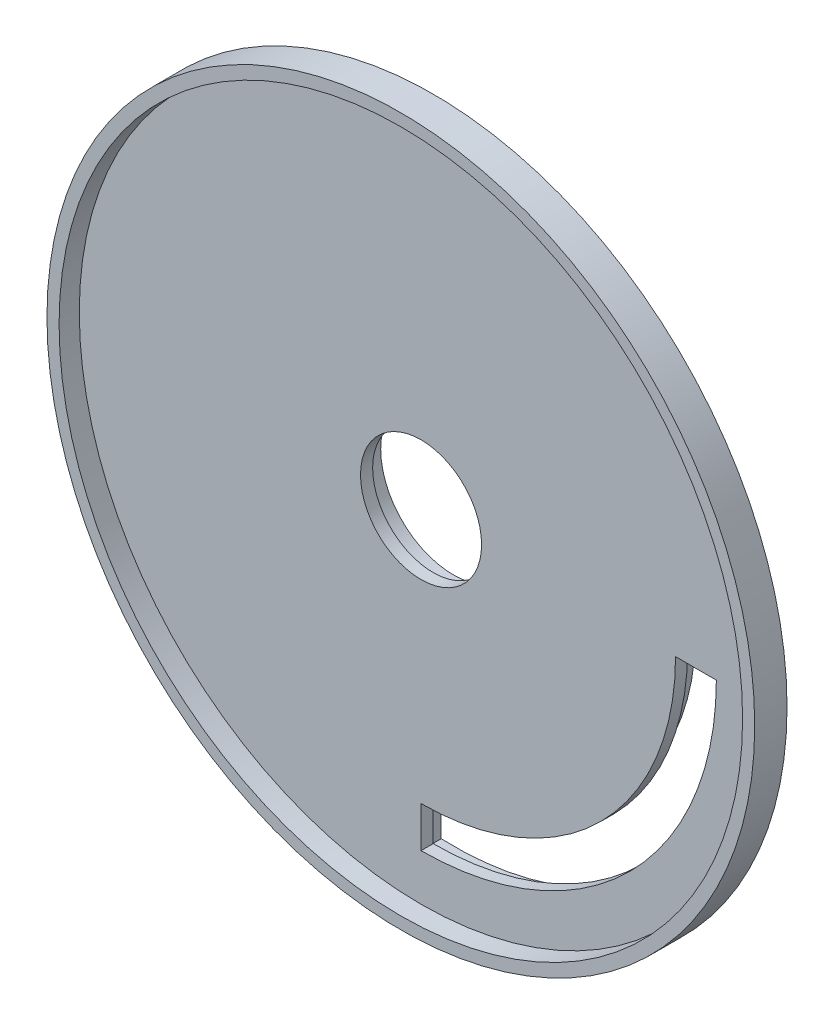
ISO-10303-21;
HEADER;
FILE_DESCRIPTION(('STEP AP214'),'2;1');
FILE_NAME('part.step','',(''),(''),'','','');
FILE_SCHEMA(('AUTOMOTIVE_DESIGN { 1 0 10303 214 1 1 1 1 }'));
ENDSEC;
DATA;
#1=APPLICATION_CONTEXT('core data for automotive mechanical design processes');
#2=APPLICATION_PROTOCOL_DEFINITION('international standard','automotive_design',2000,#1);
#3=PRODUCT_CONTEXT('',#1,'mechanical');
#4=PRODUCT('Part','Part','',(#3));
#5=PRODUCT_RELATED_PRODUCT_CATEGORY('part','',(#4));
#6=PRODUCT_DEFINITION_FORMATION('','',#4);
#7=PRODUCT_DEFINITION_CONTEXT('part definition',#1,'design');
#8=PRODUCT_DEFINITION('design','',#6,#7);
#9=PRODUCT_DEFINITION_SHAPE('','',#8);
#10=(LENGTH_UNIT() NAMED_UNIT(*) SI_UNIT(.MILLI.,.METRE.));
#11=(NAMED_UNIT(*) PLANE_ANGLE_UNIT() SI_UNIT($,.RADIAN.));
#12=(NAMED_UNIT(*) SI_UNIT($,.STERADIAN.) SOLID_ANGLE_UNIT());
#13=UNCERTAINTY_MEASURE_WITH_UNIT(LENGTH_MEASURE(1.E-05),#10,'distance_accuracy_value','');
#14=(GEOMETRIC_REPRESENTATION_CONTEXT(3) GLOBAL_UNCERTAINTY_ASSIGNED_CONTEXT((#13)) GLOBAL_UNIT_ASSIGNED_CONTEXT((#10,
#11,#12)) REPRESENTATION_CONTEXT('',''));
#15=CARTESIAN_POINT('',(0.,0.,0.));
#16=DIRECTION('',(0.,0.,1.));
#17=DIRECTION('',(1.,0.,0.));
#18=AXIS2_PLACEMENT_3D('',#15,#16,#17);
#19=CARTESIAN_POINT('',(0.,0.,0.));
#20=DIRECTION('',(0.,0.,1.));
#21=DIRECTION('',(1.,0.,0.));
#22=AXIS2_PLACEMENT_3D('',#19,#20,#21);
#23=PLANE('',#22);
#24=CARTESIAN_POINT('',(0.,0.,0.));
#25=DIRECTION('',(0.,0.,-1.));
#26=DIRECTION('',(-1.,0.,0.));
#27=AXIS2_PLACEMENT_3D('',#24,#25,#26);
#28=CIRCLE('',#27,14.9825951214007);
#29=CARTESIAN_POINT('',(-14.9825951214007,0.,0.));
#30=VERTEX_POINT('',#29);
#31=EDGE_CURVE('E239',#30,#30,#28,.T.);
#32=ORIENTED_EDGE('',*,*,#31,.F.);
#33=EDGE_LOOP('',(#32));
#34=FACE_BOUND('',#33,.T.);
#35=CARTESIAN_POINT('',(0.,0.,0.));
#36=DIRECTION('',(0.,0.,-1.));
#37=DIRECTION('',(-1.,0.,0.));
#38=AXIS2_PLACEMENT_3D('',#35,#36,#37);
#39=CIRCLE('',#38,17.9825951214007);
#40=CARTESIAN_POINT('',(-17.9825951214007,0.,0.));
#41=VERTEX_POINT('',#40);
#42=EDGE_CURVE('E250',#41,#41,#39,.T.);
#43=ORIENTED_EDGE('',*,*,#42,.T.);
#44=EDGE_LOOP('',(#43));
#45=FACE_BOUND('',#44,.T.);
#46=ADVANCED_FACE('F38',(#34,#45),#23,.F.);
#47=CARTESIAN_POINT('',(0.,0.,0.));
#48=DIRECTION('',(0.,0.,1.));
#49=DIRECTION('',(1.,0.,0.));
#50=AXIS2_PLACEMENT_3D('',#47,#48,#49);
#51=CIRCLE('',#50,20.9825951214007);
#52=CARTESIAN_POINT('',(20.9825951214007,0.,0.));
#53=VERTEX_POINT('',#52);
#54=EDGE_CURVE('E11',#53,#53,#51,.F.);
#55=ORIENTED_EDGE('',*,*,#54,.F.);
#56=EDGE_LOOP('',(#55));
#57=FACE_BOUND('',#56,.T.);
#58=CARTESIAN_POINT('',(0.,0.,0.));
#59=DIRECTION('',(0.,0.,1.));
#60=DIRECTION('',(1.,0.,0.));
#61=AXIS2_PLACEMENT_3D('',#58,#59,#60);
#62=CIRCLE('',#61,87.6);
#63=CARTESIAN_POINT('',(87.6,0.,0.));
#64=VERTEX_POINT('',#63);
#65=EDGE_CURVE('E224',#64,#64,#62,.T.);
#66=ORIENTED_EDGE('',*,*,#65,.F.);
#67=EDGE_LOOP('',(#66));
#68=FACE_BOUND('',#67,.T.);
#69=CARTESIAN_POINT('',(0.,0.,0.));
#70=DIRECTION('',(0.,0.,1.));
#71=DIRECTION('',(-1.,0.,0.));
#72=AXIS2_PLACEMENT_3D('',#69,#70,#71);
#73=CIRCLE('',#72,57.);
#74=CARTESIAN_POINT('',(-6.00000000000036,-56.6833308830735,0.));
#75=VERTEX_POINT('',#74);
#76=CARTESIAN_POINT('',(56.6833308830736,5.99999999999903,0.));
#77=VERTEX_POINT('',#76);
#78=EDGE_CURVE('E144',#75,#77,#73,.T.);
#79=ORIENTED_EDGE('',*,*,#78,.F.);
#80=DIRECTION('',(0.,1.,0.));
#81=VECTOR('',#80,1.);
#82=CARTESIAN_POINT('',(-6.00000000000036,-78.8721116745329,0.));
#83=LINE('',#82,#81);
#84=CARTESIAN_POINT('',(-6.00000000000036,-78.8721116745329,0.));
#85=VERTEX_POINT('',#84);
#86=EDGE_CURVE('E174',#85,#75,#83,.T.);
#87=ORIENTED_EDGE('',*,*,#86,.F.);
#88=CARTESIAN_POINT('',(0.,0.,0.));
#89=DIRECTION('',(0.,0.,-1.));
#90=DIRECTION('',(-1.,0.,0.));
#91=AXIS2_PLACEMENT_3D('',#88,#89,#90);
#92=CIRCLE('',#91,79.1);
#93=CARTESIAN_POINT('',(78.872111674533,5.99999999999903,0.));
#94=VERTEX_POINT('',#93);
#95=EDGE_CURVE('E58',#94,#85,#92,.T.);
#96=ORIENTED_EDGE('',*,*,#95,.F.);
#97=DIRECTION('',(1.,0.,0.));
#98=VECTOR('',#97,1.);
#99=CARTESIAN_POINT('',(56.6833308830736,5.99999999999903,0.));
#100=LINE('',#99,#98);
#101=EDGE_CURVE('E53',#77,#94,#100,.T.);
#102=ORIENTED_EDGE('',*,*,#101,.F.);
#103=EDGE_LOOP('',(#79,#87,#96,#102));
#104=FACE_BOUND('',#103,.T.);
#105=ADVANCED_FACE('F271',(#57,#68,#104),#23,.F.);
#106=DIRECTION('',(0.,1.,0.));
#107=VECTOR('',#106,1.);
#108=CARTESIAN_POINT('',(-3.00000000000036,-76.0408442877904,0.));
#109=LINE('',#108,#107);
#110=CARTESIAN_POINT('',(-3.0000000000003,-76.0408442877904,0.));
#111=VERTEX_POINT('',#110);
#112=CARTESIAN_POINT('',(-3.00000000000036,-59.9249530663145,0.));
#113=VERTEX_POINT('',#112);
#114=EDGE_CURVE('E137',#111,#113,#109,.T.);
#115=ORIENTED_EDGE('',*,*,#114,.T.);
#116=CARTESIAN_POINT('',(0.,0.,0.));
#117=DIRECTION('',(0.,0.,1.));
#118=DIRECTION('',(-1.,0.,0.));
#119=AXIS2_PLACEMENT_3D('',#116,#117,#118);
#120=CIRCLE('',#119,60.);
#121=CARTESIAN_POINT('',(59.9249530663146,2.99999999999903,0.));
#122=VERTEX_POINT('',#121);
#123=EDGE_CURVE('E157',#113,#122,#120,.T.);
#124=ORIENTED_EDGE('',*,*,#123,.T.);
#125=DIRECTION('',(1.,0.,0.));
#126=VECTOR('',#125,1.);
#127=CARTESIAN_POINT('',(59.9249530663146,2.99999999999903,0.));
#128=LINE('',#127,#126);
#129=CARTESIAN_POINT('',(76.0408442877905,2.99999999999903,0.));
#130=VERTEX_POINT('',#129);
#131=EDGE_CURVE('E143',#122,#130,#128,.T.);
#132=ORIENTED_EDGE('',*,*,#131,.T.);
#133=CARTESIAN_POINT('',(0.,0.,0.));
#134=DIRECTION('',(0.,0.,-1.));
#135=DIRECTION('',(-1.,0.,0.));
#136=AXIS2_PLACEMENT_3D('',#133,#134,#135);
#137=CIRCLE('',#136,76.1);
#138=EDGE_CURVE('E161',#130,#111,#137,.T.);
#139=ORIENTED_EDGE('',*,*,#138,.T.);
#140=EDGE_LOOP('',(#115,#124,#132,#139));
#141=FACE_BOUND('',#140,.T.);
#142=CARTESIAN_POINT('',(0.,0.,0.));
#143=DIRECTION('',(0.,0.,-1.));
#144=DIRECTION('',(-1.,0.,0.));
#145=AXIS2_PLACEMENT_3D('',#142,#143,#144);
#146=CIRCLE('',#145,63.);
#147=CARTESIAN_POINT('',(63.,0.,0.));
#148=VERTEX_POINT('',#147);
#149=CARTESIAN_POINT('',(-3.47378376064356E-13,-63.,0.));
#150=VERTEX_POINT('',#149);
#151=EDGE_CURVE('E197',#148,#150,#146,.T.);
#152=ORIENTED_EDGE('',*,*,#151,.T.);
#153=DIRECTION('',(0.,1.,0.));
#154=VECTOR('',#153,1.);
#155=CARTESIAN_POINT('',(-3.47378376064356E-13,-73.1,0.));
#156=LINE('',#155,#154);
#157=CARTESIAN_POINT('',(-3.11200960247745E-13,-73.1,0.));
#158=VERTEX_POINT('',#157);
#159=EDGE_CURVE('E200',#158,#150,#156,.T.);
#160=ORIENTED_EDGE('',*,*,#159,.F.);
#161=CARTESIAN_POINT('',(0.,0.,0.));
#162=DIRECTION('',(0.,0.,-1.));
#163=DIRECTION('',(-1.,0.,0.));
#164=AXIS2_PLACEMENT_3D('',#161,#162,#163);
#165=CIRCLE('',#164,73.1);
#166=CARTESIAN_POINT('',(73.1,3.56798109611847E-13,0.));
#167=VERTEX_POINT('',#166);
#168=EDGE_CURVE('E203',#167,#158,#165,.T.);
#169=ORIENTED_EDGE('',*,*,#168,.F.);
#170=DIRECTION('',(1.,0.,0.));
#171=VECTOR('',#170,1.);
#172=CARTESIAN_POINT('',(63.,3.55561216344708E-13,0.));
#173=LINE('',#172,#171);
#174=EDGE_CURVE('E206',#148,#167,#173,.T.);
#175=ORIENTED_EDGE('',*,*,#174,.F.);
#176=EDGE_LOOP('',(#152,#160,#169,#175));
#177=FACE_BOUND('',#176,.T.);
#178=ADVANCED_FACE('F274',(#141,#177),#23,.F.);
#179=CARTESIAN_POINT('',(0.,0.,3.));
#180=DIRECTION('',(0.,0.,1.));
#181=DIRECTION('',(1.,0.,0.));
#182=AXIS2_PLACEMENT_3D('',#179,#180,#181);
#183=PLANE('',#182);
#184=CARTESIAN_POINT('',(0.,0.,3.));
#185=DIRECTION('',(0.,0.,1.));
#186=DIRECTION('',(1.,0.,0.));
#187=AXIS2_PLACEMENT_3D('',#184,#185,#186);
#188=CIRCLE('',#187,14.9825951214007);
#189=CARTESIAN_POINT('',(14.9825951214007,0.,3.));
#190=VERTEX_POINT('',#189);
#191=EDGE_CURVE('E159',#190,#190,#188,.T.);
#192=ORIENTED_EDGE('',*,*,#191,.F.);
#193=EDGE_LOOP('',(#192));
#194=FACE_BOUND('',#193,.T.);
#195=CARTESIAN_POINT('',(0.,0.,3.));
#196=DIRECTION('',(0.,0.,1.));
#197=DIRECTION('',(1.,0.,0.));
#198=AXIS2_PLACEMENT_3D('',#195,#196,#197);
#199=CIRCLE('',#198,84.6);
#200=CARTESIAN_POINT('',(84.6,0.,3.));
#201=VERTEX_POINT('',#200);
#202=EDGE_CURVE('E227',#201,#201,#199,.F.);
#203=ORIENTED_EDGE('',*,*,#202,.F.);
#204=EDGE_LOOP('',(#203));
#205=FACE_BOUND('',#204,.T.);
#206=DIRECTION('',(0.,-1.,0.));
#207=VECTOR('',#206,1.);
#208=CARTESIAN_POINT('',(0.,0.,3.));
#209=LINE('',#208,#207);
#210=CARTESIAN_POINT('',(-3.47378376064356E-13,-63.,3.));
#211=VERTEX_POINT('',#210);
#212=CARTESIAN_POINT('',(-3.11200960247745E-13,-73.1,3.));
#213=VERTEX_POINT('',#212);
#214=EDGE_CURVE('E235',#211,#213,#209,.T.);
#215=ORIENTED_EDGE('',*,*,#214,.F.);
#216=CARTESIAN_POINT('',(0.,0.,3.));
#217=DIRECTION('',(0.,0.,1.));
#218=DIRECTION('',(1.,0.,0.));
#219=AXIS2_PLACEMENT_3D('',#216,#217,#218);
#220=CIRCLE('',#219,63.);
#221=CARTESIAN_POINT('',(63.,3.55561216344708E-13,3.));
#222=VERTEX_POINT('',#221);
#223=EDGE_CURVE('E46',#211,#222,#220,.T.);
#224=ORIENTED_EDGE('',*,*,#223,.T.);
#225=DIRECTION('',(-1.,0.,0.));
#226=VECTOR('',#225,1.);
#227=CARTESIAN_POINT('',(0.,0.,3.));
#228=LINE('',#227,#226);
#229=CARTESIAN_POINT('',(73.1,0.,3.));
#230=VERTEX_POINT('',#229);
#231=EDGE_CURVE('E230',#230,#222,#228,.T.);
#232=ORIENTED_EDGE('',*,*,#231,.F.);
#233=CARTESIAN_POINT('',(0.,0.,3.));
#234=DIRECTION('',(0.,0.,1.));
#235=DIRECTION('',(1.,0.,0.));
#236=AXIS2_PLACEMENT_3D('',#233,#234,#235);
#237=CIRCLE('',#236,73.1);
#238=EDGE_CURVE('E232',#213,#230,#237,.T.);
#239=ORIENTED_EDGE('',*,*,#238,.F.);
#240=EDGE_LOOP('',(#215,#224,#232,#239));
#241=FACE_BOUND('',#240,.T.);
#242=ADVANCED_FACE('F307',(#194,#205,#241),#183,.T.);
#243=CARTESIAN_POINT('',(0.,0.,3.));
#244=DIRECTION('',(0.,0.,-1.));
#245=DIRECTION('',(-1.,0.,0.));
#246=AXIS2_PLACEMENT_3D('',#243,#244,#245);
#247=CYLINDRICAL_SURFACE('',#246,87.6);
#248=ORIENTED_EDGE('',*,*,#65,.T.);
#249=EDGE_LOOP('',(#248));
#250=FACE_BOUND('',#249,.T.);
#251=CARTESIAN_POINT('',(0.,0.,8.));
#252=DIRECTION('',(0.,0.,1.));
#253=DIRECTION('',(1.,0.,0.));
#254=AXIS2_PLACEMENT_3D('',#251,#252,#253);
#255=CIRCLE('',#254,87.6);
#256=CARTESIAN_POINT('',(87.6,0.,8.));
#257=VERTEX_POINT('',#256);
#258=EDGE_CURVE('E221',#257,#257,#255,.T.);
#259=ORIENTED_EDGE('',*,*,#258,.F.);
#260=EDGE_LOOP('',(#259));
#261=FACE_BOUND('',#260,.T.);
#262=ADVANCED_FACE('F40',(#250,#261),#247,.T.);
#263=CARTESIAN_POINT('',(0.,0.,8.));
#264=DIRECTION('',(0.,0.,1.));
#265=DIRECTION('',(1.,0.,0.));
#266=AXIS2_PLACEMENT_3D('',#263,#264,#265);
#267=PLANE('',#266);
#268=ORIENTED_EDGE('',*,*,#258,.T.);
#269=EDGE_LOOP('',(#268));
#270=FACE_BOUND('',#269,.T.);
#271=CARTESIAN_POINT('',(0.,0.,8.));
#272=DIRECTION('',(0.,0.,1.));
#273=DIRECTION('',(1.,0.,0.));
#274=AXIS2_PLACEMENT_3D('',#271,#272,#273);
#275=CIRCLE('',#274,84.6);
#276=CARTESIAN_POINT('',(84.6,0.,8.));
#277=VERTEX_POINT('',#276);
#278=EDGE_CURVE('E218',#277,#277,#275,.T.);
#279=ORIENTED_EDGE('',*,*,#278,.F.);
#280=EDGE_LOOP('',(#279));
#281=FACE_BOUND('',#280,.T.);
#282=ADVANCED_FACE('F347',(#270,#281),#267,.T.);
#283=CARTESIAN_POINT('',(0.,0.,8.));
#284=DIRECTION('',(0.,0.,-1.));
#285=DIRECTION('',(-1.,0.,0.));
#286=AXIS2_PLACEMENT_3D('',#283,#284,#285);
#287=CYLINDRICAL_SURFACE('',#286,84.6);
#288=ORIENTED_EDGE('',*,*,#278,.T.);
#289=EDGE_LOOP('',(#288));
#290=FACE_BOUND('',#289,.T.);
#291=ORIENTED_EDGE('',*,*,#202,.T.);
#292=EDGE_LOOP('',(#291));
#293=FACE_BOUND('',#292,.T.);
#294=ADVANCED_FACE('F344',(#290,#293),#287,.F.);
#295=CARTESIAN_POINT('',(0.,0.,5.));
#296=DIRECTION('',(0.,0.,-1.));
#297=DIRECTION('',(-1.,0.,0.));
#298=AXIS2_PLACEMENT_3D('',#295,#296,#297);
#299=CYLINDRICAL_SURFACE('',#298,63.);
#300=DIRECTION('',(0.,0.,-1.));
#301=VECTOR('',#300,1.);
#302=CARTESIAN_POINT('',(-3.47378376064356E-13,-63.,5.));
#303=LINE('',#302,#301);
#304=EDGE_CURVE('E216',#211,#150,#303,.T.);
#305=ORIENTED_EDGE('',*,*,#304,.T.);
#306=ORIENTED_EDGE('',*,*,#151,.F.);
#307=DIRECTION('',(0.,0.,-1.));
#308=VECTOR('',#307,1.);
#309=CARTESIAN_POINT('',(63.,3.55561216344708E-13,5.));
#310=LINE('',#309,#308);
#311=EDGE_CURVE('E209',#222,#148,#310,.T.);
#312=ORIENTED_EDGE('',*,*,#311,.F.);
#313=ORIENTED_EDGE('',*,*,#223,.F.);
#314=EDGE_LOOP('',(#305,#306,#312,#313));
#315=FACE_BOUND('',#314,.T.);
#316=ADVANCED_FACE('F320',(#315),#299,.T.);
#317=CARTESIAN_POINT('',(-3.47378376064356E-13,-73.1,5.));
#318=DIRECTION('',(-1.,0.,0.));
#319=DIRECTION('',(0.,0.,1.));
#320=AXIS2_PLACEMENT_3D('',#317,#318,#319);
#321=PLANE('',#320);
#322=ORIENTED_EDGE('',*,*,#214,.T.);
#323=DIRECTION('',(0.,0.,-1.));
#324=VECTOR('',#323,1.);
#325=CARTESIAN_POINT('',(-3.11200960247745E-13,-73.1,5.));
#326=LINE('',#325,#324);
#327=EDGE_CURVE('E214',#213,#158,#326,.T.);
#328=ORIENTED_EDGE('',*,*,#327,.T.);
#329=ORIENTED_EDGE('',*,*,#159,.T.);
#330=ORIENTED_EDGE('',*,*,#304,.F.);
#331=EDGE_LOOP('',(#322,#328,#329,#330));
#332=FACE_BOUND('',#331,.T.);
#333=ADVANCED_FACE('F329',(#332),#321,.F.);
#334=CARTESIAN_POINT('',(0.,0.,5.));
#335=DIRECTION('',(0.,0.,-1.));
#336=DIRECTION('',(-1.,0.,0.));
#337=AXIS2_PLACEMENT_3D('',#334,#335,#336);
#338=CYLINDRICAL_SURFACE('',#337,73.1);
#339=ORIENTED_EDGE('',*,*,#238,.T.);
#340=DIRECTION('',(0.,0.,-1.));
#341=VECTOR('',#340,1.);
#342=CARTESIAN_POINT('',(73.1,3.56798109611847E-13,5.));
#343=LINE('',#342,#341);
#344=EDGE_CURVE('E212',#230,#167,#343,.T.);
#345=ORIENTED_EDGE('',*,*,#344,.T.);
#346=ORIENTED_EDGE('',*,*,#168,.T.);
#347=ORIENTED_EDGE('',*,*,#327,.F.);
#348=EDGE_LOOP('',(#339,#345,#346,#347));
#349=FACE_BOUND('',#348,.T.);
#350=ADVANCED_FACE('F332',(#349),#338,.F.);
#351=CARTESIAN_POINT('',(63.,3.55561216344708E-13,5.));
#352=DIRECTION('',(0.,1.,0.));
#353=DIRECTION('',(-1.,0.,0.));
#354=AXIS2_PLACEMENT_3D('',#351,#352,#353);
#355=PLANE('',#354);
#356=ORIENTED_EDGE('',*,*,#231,.T.);
#357=ORIENTED_EDGE('',*,*,#311,.T.);
#358=ORIENTED_EDGE('',*,*,#174,.T.);
#359=ORIENTED_EDGE('',*,*,#344,.F.);
#360=EDGE_LOOP('',(#356,#357,#358,#359));
#361=FACE_BOUND('',#360,.T.);
#362=ADVANCED_FACE('F323',(#361),#355,.F.);
#363=CARTESIAN_POINT('',(0.,0.,-5.));
#364=DIRECTION('',(0.,0.,-1.));
#365=DIRECTION('',(-1.,0.,0.));
#366=AXIS2_PLACEMENT_3D('',#363,#364,#365);
#367=PLANE('',#366);
#368=CARTESIAN_POINT('',(0.,0.,-5.));
#369=DIRECTION('',(0.,0.,1.));
#370=DIRECTION('',(-1.,0.,0.));
#371=AXIS2_PLACEMENT_3D('',#368,#369,#370);
#372=CIRCLE('',#371,57.);
#373=CARTESIAN_POINT('',(-6.00000000000036,-56.6833308830735,-5.));
#374=VERTEX_POINT('',#373);
#375=CARTESIAN_POINT('',(56.6833308830736,5.99999999999903,-5.));
#376=VERTEX_POINT('',#375);
#377=EDGE_CURVE('E170',#374,#376,#372,.T.);
#378=ORIENTED_EDGE('',*,*,#377,.T.);
#379=DIRECTION('',(1.,0.,0.));
#380=VECTOR('',#379,1.);
#381=CARTESIAN_POINT('',(56.6833308830736,5.99999999999903,-5.));
#382=LINE('',#381,#380);
#383=CARTESIAN_POINT('',(78.872111674533,5.99999999999903,-5.));
#384=VERTEX_POINT('',#383);
#385=EDGE_CURVE('E173',#376,#384,#382,.T.);
#386=ORIENTED_EDGE('',*,*,#385,.T.);
#387=CARTESIAN_POINT('',(0.,0.,-5.));
#388=DIRECTION('',(0.,0.,-1.));
#389=DIRECTION('',(-1.,0.,0.));
#390=AXIS2_PLACEMENT_3D('',#387,#388,#389);
#391=CIRCLE('',#390,79.1);
#392=CARTESIAN_POINT('',(-6.00000000000037,-78.8721116745329,-5.));
#393=VERTEX_POINT('',#392);
#394=EDGE_CURVE('E176',#384,#393,#391,.T.);
#395=ORIENTED_EDGE('',*,*,#394,.T.);
#396=DIRECTION('',(0.,1.,0.));
#397=VECTOR('',#396,1.);
#398=CARTESIAN_POINT('',(-6.00000000000036,-78.8721116745329,-5.));
#399=LINE('',#398,#397);
#400=EDGE_CURVE('E178',#393,#374,#399,.T.);
#401=ORIENTED_EDGE('',*,*,#400,.T.);
#402=EDGE_LOOP('',(#378,#386,#395,#401));
#403=FACE_BOUND('',#402,.T.);
#404=DIRECTION('',(1.,0.,0.));
#405=VECTOR('',#404,1.);
#406=CARTESIAN_POINT('',(59.9249530663146,2.99999999999903,-5.));
#407=LINE('',#406,#405);
#408=CARTESIAN_POINT('',(59.9249530663146,2.99999999999903,-5.));
#409=VERTEX_POINT('',#408);
#410=CARTESIAN_POINT('',(76.0408442877905,2.99999999999903,-5.));
#411=VERTEX_POINT('',#410);
#412=EDGE_CURVE('E136',#409,#411,#407,.T.);
#413=ORIENTED_EDGE('',*,*,#412,.F.);
#414=CARTESIAN_POINT('',(0.,0.,-5.));
#415=DIRECTION('',(0.,0.,1.));
#416=DIRECTION('',(-1.,0.,0.));
#417=AXIS2_PLACEMENT_3D('',#414,#415,#416);
#418=CIRCLE('',#417,60.);
#419=CARTESIAN_POINT('',(-3.00000000000036,-59.9249530663145,-5.));
#420=VERTEX_POINT('',#419);
#421=EDGE_CURVE('E126',#420,#409,#418,.T.);
#422=ORIENTED_EDGE('',*,*,#421,.F.);
#423=DIRECTION('',(0.,1.,0.));
#424=VECTOR('',#423,1.);
#425=CARTESIAN_POINT('',(-3.00000000000036,-76.0408442877904,-5.));
#426=LINE('',#425,#424);
#427=CARTESIAN_POINT('',(-3.00000000000036,-76.0408442877904,-5.));
#428=VERTEX_POINT('',#427);
#429=EDGE_CURVE('E152',#428,#420,#426,.T.);
#430=ORIENTED_EDGE('',*,*,#429,.F.);
#431=CARTESIAN_POINT('',(0.,0.,-5.));
#432=DIRECTION('',(0.,0.,-1.));
#433=DIRECTION('',(-1.,0.,0.));
#434=AXIS2_PLACEMENT_3D('',#431,#432,#433);
#435=CIRCLE('',#434,76.1);
#436=EDGE_CURVE('E150',#411,#428,#435,.T.);
#437=ORIENTED_EDGE('',*,*,#436,.F.);
#438=EDGE_LOOP('',(#413,#422,#430,#437));
#439=FACE_BOUND('',#438,.T.);
#440=ADVANCED_FACE('F148',(#403,#439),#367,.T.);
#441=CARTESIAN_POINT('',(0.,0.,-5.));
#442=DIRECTION('',(0.,0.,1.));
#443=DIRECTION('',(1.,0.,0.));
#444=AXIS2_PLACEMENT_3D('',#441,#442,#443);
#445=CYLINDRICAL_SURFACE('',#444,57.);
#446=ORIENTED_EDGE('',*,*,#78,.T.);
#447=DIRECTION('',(0.,0.,1.));
#448=VECTOR('',#447,1.);
#449=CARTESIAN_POINT('',(56.6833308830736,5.99999999999903,-5.));
#450=LINE('',#449,#448);
#451=EDGE_CURVE('E195',#376,#77,#450,.T.);
#452=ORIENTED_EDGE('',*,*,#451,.F.);
#453=ORIENTED_EDGE('',*,*,#377,.F.);
#454=DIRECTION('',(0.,0.,1.));
#455=VECTOR('',#454,1.);
#456=CARTESIAN_POINT('',(-6.00000000000036,-56.6833308830735,-5.));
#457=LINE('',#456,#455);
#458=EDGE_CURVE('E180',#374,#75,#457,.T.);
#459=ORIENTED_EDGE('',*,*,#458,.T.);
#460=EDGE_LOOP('',(#446,#452,#453,#459));
#461=FACE_BOUND('',#460,.T.);
#462=ADVANCED_FACE('F284',(#461),#445,.F.);
#463=CARTESIAN_POINT('',(56.6833308830736,5.99999999999903,-5.));
#464=DIRECTION('',(0.,-1.,0.));
#465=DIRECTION('',(0.,0.,-1.));
#466=AXIS2_PLACEMENT_3D('',#463,#464,#465);
#467=PLANE('',#466);
#468=ORIENTED_EDGE('',*,*,#101,.T.);
#469=DIRECTION('',(0.,0.,1.));
#470=VECTOR('',#469,1.);
#471=CARTESIAN_POINT('',(78.872111674533,5.99999999999903,-5.));
#472=LINE('',#471,#470);
#473=EDGE_CURVE('E192',#384,#94,#472,.T.);
#474=ORIENTED_EDGE('',*,*,#473,.F.);
#475=ORIENTED_EDGE('',*,*,#385,.F.);
#476=ORIENTED_EDGE('',*,*,#451,.T.);
#477=EDGE_LOOP('',(#468,#474,#475,#476));
#478=FACE_BOUND('',#477,.T.);
#479=ADVANCED_FACE('F291',(#478),#467,.F.);
#480=CARTESIAN_POINT('',(0.,0.,-5.));
#481=DIRECTION('',(0.,0.,1.));
#482=DIRECTION('',(1.,0.,0.));
#483=AXIS2_PLACEMENT_3D('',#480,#481,#482);
#484=CYLINDRICAL_SURFACE('',#483,79.1);
#485=ORIENTED_EDGE('',*,*,#95,.T.);
#486=DIRECTION('',(0.,0.,1.));
#487=VECTOR('',#486,1.);
#488=CARTESIAN_POINT('',(-6.00000000000037,-78.8721116745329,-5.));
#489=LINE('',#488,#487);
#490=EDGE_CURVE('E189',#393,#85,#489,.T.);
#491=ORIENTED_EDGE('',*,*,#490,.F.);
#492=ORIENTED_EDGE('',*,*,#394,.F.);
#493=ORIENTED_EDGE('',*,*,#473,.T.);
#494=EDGE_LOOP('',(#485,#491,#492,#493));
#495=FACE_BOUND('',#494,.T.);
#496=ADVANCED_FACE('F289',(#495),#484,.T.);
#497=CARTESIAN_POINT('',(-6.00000000000036,-78.8721116745329,-5.));
#498=DIRECTION('',(1.,0.,0.));
#499=DIRECTION('',(0.,0.,-1.));
#500=AXIS2_PLACEMENT_3D('',#497,#498,#499);
#501=PLANE('',#500);
#502=ORIENTED_EDGE('',*,*,#86,.T.);
#503=ORIENTED_EDGE('',*,*,#458,.F.);
#504=ORIENTED_EDGE('',*,*,#400,.F.);
#505=ORIENTED_EDGE('',*,*,#490,.T.);
#506=EDGE_LOOP('',(#502,#503,#504,#505));
#507=FACE_BOUND('',#506,.T.);
#508=ADVANCED_FACE('F280',(#507),#501,.F.);
#509=CARTESIAN_POINT('',(0.,0.,-5.));
#510=DIRECTION('',(0.,0.,1.));
#511=DIRECTION('',(1.,0.,0.));
#512=AXIS2_PLACEMENT_3D('',#509,#510,#511);
#513=CYLINDRICAL_SURFACE('',#512,60.);
#514=ORIENTED_EDGE('',*,*,#123,.F.);
#515=DIRECTION('',(0.,0.,1.));
#516=VECTOR('',#515,1.);
#517=CARTESIAN_POINT('',(-3.00000000000036,-59.9249530663145,-5.));
#518=LINE('',#517,#516);
#519=EDGE_CURVE('E132',#420,#113,#518,.T.);
#520=ORIENTED_EDGE('',*,*,#519,.F.);
#521=ORIENTED_EDGE('',*,*,#421,.T.);
#522=DIRECTION('',(0.,0.,1.));
#523=VECTOR('',#522,1.);
#524=CARTESIAN_POINT('',(59.9249530663146,2.99999999999903,-5.));
#525=LINE('',#524,#523);
#526=EDGE_CURVE('E130',#409,#122,#525,.T.);
#527=ORIENTED_EDGE('',*,*,#526,.T.);
#528=EDGE_LOOP('',(#514,#520,#521,#527));
#529=FACE_BOUND('',#528,.T.);
#530=ADVANCED_FACE('F129',(#529),#513,.T.);
#531=CARTESIAN_POINT('',(59.9249530663146,2.99999999999903,-5.));
#532=DIRECTION('',(0.,-1.,0.));
#533=DIRECTION('',(0.,0.,-1.));
#534=AXIS2_PLACEMENT_3D('',#531,#532,#533);
#535=PLANE('',#534);
#536=ORIENTED_EDGE('',*,*,#131,.F.);
#537=ORIENTED_EDGE('',*,*,#526,.F.);
#538=ORIENTED_EDGE('',*,*,#412,.T.);
#539=DIRECTION('',(0.,0.,1.));
#540=VECTOR('',#539,1.);
#541=CARTESIAN_POINT('',(76.0408442877905,2.99999999999903,-5.));
#542=LINE('',#541,#540);
#543=EDGE_CURVE('E145',#411,#130,#542,.T.);
#544=ORIENTED_EDGE('',*,*,#543,.T.);
#545=EDGE_LOOP('',(#536,#537,#538,#544));
#546=FACE_BOUND('',#545,.T.);
#547=ADVANCED_FACE('F140',(#546),#535,.T.);
#548=CARTESIAN_POINT('',(0.,0.,-5.));
#549=DIRECTION('',(0.,0.,1.));
#550=DIRECTION('',(1.,0.,0.));
#551=AXIS2_PLACEMENT_3D('',#548,#549,#550);
#552=CYLINDRICAL_SURFACE('',#551,76.1);
#553=ORIENTED_EDGE('',*,*,#138,.F.);
#554=ORIENTED_EDGE('',*,*,#543,.F.);
#555=ORIENTED_EDGE('',*,*,#436,.T.);
#556=DIRECTION('',(0.,0.,1.));
#557=VECTOR('',#556,1.);
#558=CARTESIAN_POINT('',(-3.0000000000003,-76.0408442877904,-5.));
#559=LINE('',#558,#557);
#560=EDGE_CURVE('E167',#428,#111,#559,.T.);
#561=ORIENTED_EDGE('',*,*,#560,.T.);
#562=EDGE_LOOP('',(#553,#554,#555,#561));
#563=FACE_BOUND('',#562,.T.);
#564=ADVANCED_FACE('F423',(#563),#552,.F.);
#565=CARTESIAN_POINT('',(-3.00000000000036,-76.0408442877904,-5.));
#566=DIRECTION('',(1.,0.,0.));
#567=DIRECTION('',(0.,0.,-1.));
#568=AXIS2_PLACEMENT_3D('',#565,#566,#567);
#569=PLANE('',#568);
#570=ORIENTED_EDGE('',*,*,#114,.F.);
#571=ORIENTED_EDGE('',*,*,#560,.F.);
#572=ORIENTED_EDGE('',*,*,#429,.T.);
#573=ORIENTED_EDGE('',*,*,#519,.T.);
#574=EDGE_LOOP('',(#570,#571,#572,#573));
#575=FACE_BOUND('',#574,.T.);
#576=ADVANCED_FACE('F376',(#575),#569,.T.);
#577=CARTESIAN_POINT('',(0.,0.,5.));
#578=DIRECTION('',(0.,0.,-1.));
#579=DIRECTION('',(-1.,0.,0.));
#580=AXIS2_PLACEMENT_3D('',#577,#578,#579);
#581=CYLINDRICAL_SURFACE('',#580,14.9825951214007);
#582=ORIENTED_EDGE('',*,*,#191,.T.);
#583=EDGE_LOOP('',(#582));
#584=FACE_BOUND('',#583,.T.);
#585=ORIENTED_EDGE('',*,*,#31,.T.);
#586=EDGE_LOOP('',(#585));
#587=FACE_BOUND('',#586,.T.);
#588=ADVANCED_FACE('F381',(#584,#587),#581,.F.);
#589=CARTESIAN_POINT('',(0.,0.,-5.));
#590=DIRECTION('',(0.,0.,1.));
#591=DIRECTION('',(1.,0.,0.));
#592=AXIS2_PLACEMENT_3D('',#589,#590,#591);
#593=CYLINDRICAL_SURFACE('',#592,17.9825951214007);
#594=CARTESIAN_POINT('',(0.,0.,-5.));
#595=DIRECTION('',(0.,0.,-1.));
#596=DIRECTION('',(-1.,0.,0.));
#597=AXIS2_PLACEMENT_3D('',#594,#595,#596);
#598=CIRCLE('',#597,17.9825951214007);
#599=CARTESIAN_POINT('',(-17.9825951214007,0.,-5.));
#600=VERTEX_POINT('',#599);
#601=EDGE_CURVE('E247',#600,#600,#598,.T.);
#602=ORIENTED_EDGE('',*,*,#601,.T.);
#603=EDGE_LOOP('',(#602));
#604=FACE_BOUND('',#603,.T.);
#605=ORIENTED_EDGE('',*,*,#42,.F.);
#606=EDGE_LOOP('',(#605));
#607=FACE_BOUND('',#606,.T.);
#608=ADVANCED_FACE('F256',(#604,#607),#593,.F.);
#609=CARTESIAN_POINT('',(0.,0.,-5.));
#610=DIRECTION('',(0.,0.,1.));
#611=DIRECTION('',(1.,0.,0.));
#612=AXIS2_PLACEMENT_3D('',#609,#610,#611);
#613=CYLINDRICAL_SURFACE('',#612,20.9825951214007);
#614=CARTESIAN_POINT('',(0.,0.,-5.));
#615=DIRECTION('',(0.,0.,-1.));
#616=DIRECTION('',(-1.,0.,0.));
#617=AXIS2_PLACEMENT_3D('',#614,#615,#616);
#618=CIRCLE('',#617,20.9825951214007);
#619=CARTESIAN_POINT('',(-20.9825951214007,0.,-5.));
#620=VERTEX_POINT('',#619);
#621=EDGE_CURVE('E243',#620,#620,#618,.T.);
#622=ORIENTED_EDGE('',*,*,#621,.F.);
#623=EDGE_LOOP('',(#622));
#624=FACE_BOUND('',#623,.T.);
#625=ORIENTED_EDGE('',*,*,#54,.T.);
#626=EDGE_LOOP('',(#625));
#627=FACE_BOUND('',#626,.T.);
#628=ADVANCED_FACE('F262',(#624,#627),#613,.T.);
#629=CARTESIAN_POINT('',(0.,0.,-5.));
#630=DIRECTION('',(0.,0.,-1.));
#631=DIRECTION('',(-1.,0.,0.));
#632=AXIS2_PLACEMENT_3D('',#629,#630,#631);
#633=PLANE('',#632);
#634=ORIENTED_EDGE('',*,*,#601,.F.);
#635=EDGE_LOOP('',(#634));
#636=FACE_BOUND('',#635,.T.);
#637=ORIENTED_EDGE('',*,*,#621,.T.);
#638=EDGE_LOOP('',(#637));
#639=FACE_BOUND('',#638,.T.);
#640=ADVANCED_FACE('F259',(#636,#639),#633,.T.);
#641=CLOSED_SHELL('',(#46,#105,#178,#242,#262,#282,#294,#316,#333,#350,#362,#440,#462,#479,#496,
#508,#530,#547,#564,#576,#588,#608,#628,#640));
#642=MANIFOLD_SOLID_BREP('B2',#641);
#643=ADVANCED_BREP_SHAPE_REPRESENTATION('',(#18,#642),#14);
#644=SHAPE_DEFINITION_REPRESENTATION(#9,#643);
ENDSEC;
END-ISO-10303-21;
